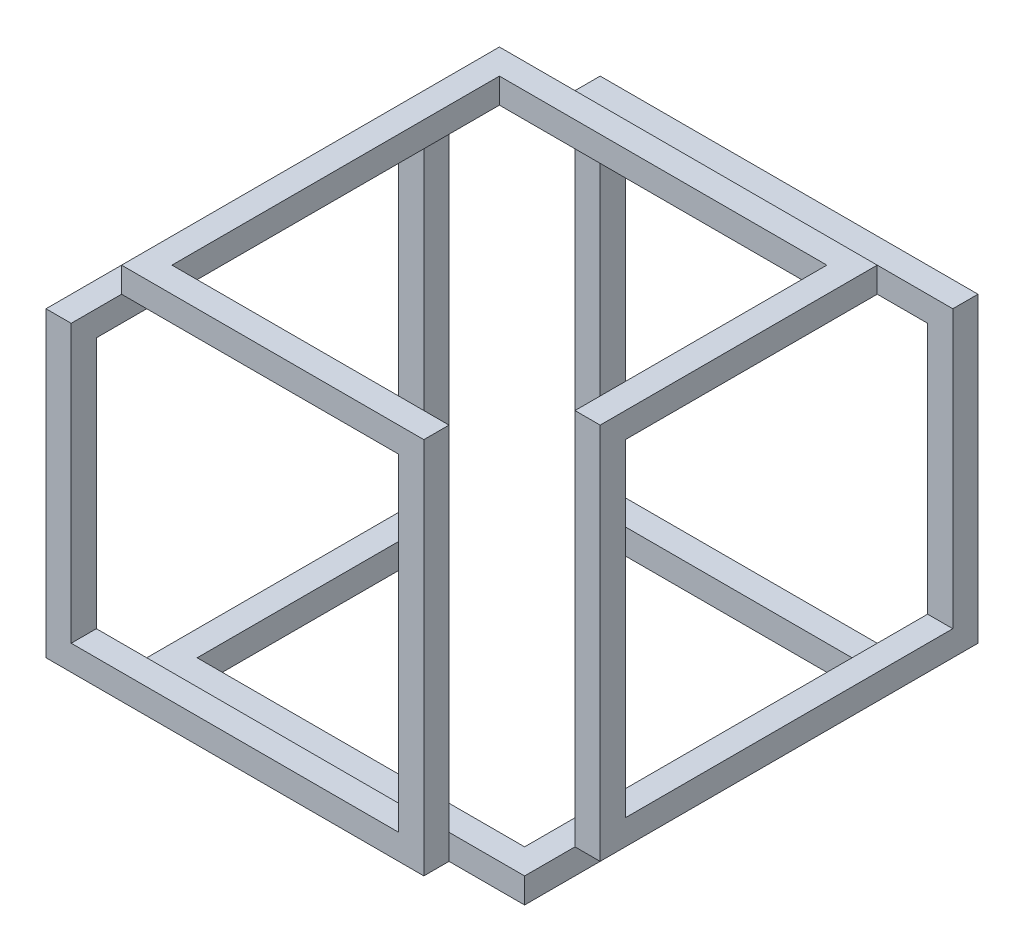
ISO-10303-21;
HEADER;
FILE_DESCRIPTION(('STEP AP214'),'2;1');
FILE_NAME('part.step','',(''),(''),'','','');
FILE_SCHEMA(('AUTOMOTIVE_DESIGN { 1 0 10303 214 1 1 1 1 }'));
ENDSEC;
DATA;
#1=APPLICATION_CONTEXT('core data for automotive mechanical design processes');
#2=APPLICATION_PROTOCOL_DEFINITION('international standard','automotive_design',2000,#1);
#3=PRODUCT_CONTEXT('',#1,'mechanical');
#4=PRODUCT('Part','Part','',(#3));
#5=PRODUCT_RELATED_PRODUCT_CATEGORY('part','',(#4));
#6=PRODUCT_DEFINITION_FORMATION('','',#4);
#7=PRODUCT_DEFINITION_CONTEXT('part definition',#1,'design');
#8=PRODUCT_DEFINITION('design','',#6,#7);
#9=PRODUCT_DEFINITION_SHAPE('','',#8);
#10=(LENGTH_UNIT() NAMED_UNIT(*) SI_UNIT(.MILLI.,.METRE.));
#11=(NAMED_UNIT(*) PLANE_ANGLE_UNIT() SI_UNIT($,.RADIAN.));
#12=(NAMED_UNIT(*) SI_UNIT($,.STERADIAN.) SOLID_ANGLE_UNIT());
#13=UNCERTAINTY_MEASURE_WITH_UNIT(LENGTH_MEASURE(1.E-05),#10,'distance_accuracy_value','');
#14=(GEOMETRIC_REPRESENTATION_CONTEXT(3) GLOBAL_UNCERTAINTY_ASSIGNED_CONTEXT((#13)) GLOBAL_UNIT_ASSIGNED_CONTEXT((#10,
#11,#12)) REPRESENTATION_CONTEXT('',''));
#15=CARTESIAN_POINT('',(0.,0.,0.));
#16=DIRECTION('',(0.,0.,1.));
#17=DIRECTION('',(1.,0.,0.));
#18=AXIS2_PLACEMENT_3D('',#15,#16,#17);
#19=CARTESIAN_POINT('',(74.9999999999999,95.,40.));
#20=DIRECTION('',(0.,1.,0.));
#21=DIRECTION('',(0.,0.,1.));
#22=AXIS2_PLACEMENT_3D('',#19,#20,#21);
#23=PLANE('',#22);
#24=DIRECTION('',(0.,0.,-1.));
#25=VECTOR('',#24,1.);
#26=CARTESIAN_POINT('',(35.,95.,180.));
#27=LINE('',#26,#25);
#28=CARTESIAN_POINT('',(35.,95.,190.));
#29=VERTEX_POINT('',#28);
#30=CARTESIAN_POINT('',(35.,95.,180.));
#31=VERTEX_POINT('',#30);
#32=EDGE_CURVE('E281',#29,#31,#27,.T.);
#33=ORIENTED_EDGE('',*,*,#32,.F.);
#34=DIRECTION('',(1.,0.,0.));
#35=VECTOR('',#34,1.);
#36=CARTESIAN_POINT('',(-75.,95.,190.));
#37=LINE('',#36,#35);
#38=CARTESIAN_POINT('',(-75.,95.,190.));
#39=VERTEX_POINT('',#38);
#40=EDGE_CURVE('E292',#39,#29,#37,.T.);
#41=ORIENTED_EDGE('',*,*,#40,.F.);
#42=DIRECTION('',(0.,0.,1.));
#43=VECTOR('',#42,1.);
#44=CARTESIAN_POINT('',(-75.,95.,40.));
#45=LINE('',#44,#43);
#46=CARTESIAN_POINT('',(-75.,95.,40.));
#47=VERTEX_POINT('',#46);
#48=EDGE_CURVE('E326',#47,#39,#45,.T.);
#49=ORIENTED_EDGE('',*,*,#48,.F.);
#50=DIRECTION('',(-1.,0.,0.));
#51=VECTOR('',#50,1.);
#52=CARTESIAN_POINT('',(74.9999999999999,95.,40.));
#53=LINE('',#52,#51);
#54=CARTESIAN_POINT('',(74.9999999999999,95.,40.));
#55=VERTEX_POINT('',#54);
#56=EDGE_CURVE('E347',#55,#47,#53,.T.);
#57=ORIENTED_EDGE('',*,*,#56,.F.);
#58=DIRECTION('',(0.,0.,1.));
#59=VECTOR('',#58,1.);
#60=CARTESIAN_POINT('',(74.9999999999999,95.,40.));
#61=LINE('',#60,#59);
#62=CARTESIAN_POINT('',(74.9999999999999,95.,140.));
#63=VERTEX_POINT('',#62);
#64=EDGE_CURVE('E360',#55,#63,#61,.T.);
#65=ORIENTED_EDGE('',*,*,#64,.T.);
#66=DIRECTION('',(-1.,0.,0.));
#67=VECTOR('',#66,1.);
#68=CARTESIAN_POINT('',(74.9999999999999,95.,140.));
#69=LINE('',#68,#67);
#70=CARTESIAN_POINT('',(64.9999999999999,95.,140.));
#71=VERTEX_POINT('',#70);
#72=EDGE_CURVE('E342',#63,#71,#69,.T.);
#73=ORIENTED_EDGE('',*,*,#72,.T.);
#74=DIRECTION('',(0.,0.,1.));
#75=VECTOR('',#74,1.);
#76=CARTESIAN_POINT('',(64.9999999999999,95.,40.));
#77=LINE('',#76,#75);
#78=CARTESIAN_POINT('',(65.,95.,50.));
#79=VERTEX_POINT('',#78);
#80=EDGE_CURVE('E354',#79,#71,#77,.T.);
#81=ORIENTED_EDGE('',*,*,#80,.F.);
#82=DIRECTION('',(1.,0.,0.));
#83=VECTOR('',#82,1.);
#84=CARTESIAN_POINT('',(-75.,95.,50.));
#85=LINE('',#84,#83);
#86=CARTESIAN_POINT('',(-65.,95.,50.));
#87=VERTEX_POINT('',#86);
#88=EDGE_CURVE('E339',#87,#79,#85,.T.);
#89=ORIENTED_EDGE('',*,*,#88,.F.);
#90=DIRECTION('',(0.,0.,-1.));
#91=VECTOR('',#90,1.);
#92=CARTESIAN_POINT('',(-65.,95.,190.));
#93=LINE('',#92,#91);
#94=CARTESIAN_POINT('',(-65.,95.,180.));
#95=VERTEX_POINT('',#94);
#96=EDGE_CURVE('E318',#95,#87,#93,.T.);
#97=ORIENTED_EDGE('',*,*,#96,.F.);
#98=DIRECTION('',(-1.,0.,0.));
#99=VECTOR('',#98,1.);
#100=CARTESIAN_POINT('',(45.,95.,180.));
#101=LINE('',#100,#99);
#102=EDGE_CURVE('E295',#31,#95,#101,.T.);
#103=ORIENTED_EDGE('',*,*,#102,.F.);
#104=EDGE_LOOP('',(#33,#41,#49,#57,#65,#73,#81,#89,#97,#103));
#105=FACE_BOUND('',#104,.T.);
#106=ADVANCED_FACE('F41',(#105),#23,.F.);
#107=CARTESIAN_POINT('',(45.,-34.9999999999998,190.));
#108=DIRECTION('',(0.,-1.,0.));
#109=DIRECTION('',(1.,0.,0.));
#110=AXIS2_PLACEMENT_3D('',#107,#108,#109);
#111=PLANE('',#110);
#112=DIRECTION('',(0.,0.,1.));
#113=VECTOR('',#112,1.);
#114=CARTESIAN_POINT('',(35.,-34.9999999999998,190.));
#115=LINE('',#114,#113);
#116=CARTESIAN_POINT('',(35.,-34.9999999999998,180.));
#117=VERTEX_POINT('',#116);
#118=CARTESIAN_POINT('',(35.,-34.9999999999998,190.));
#119=VERTEX_POINT('',#118);
#120=EDGE_CURVE('E11',#117,#119,#115,.T.);
#121=ORIENTED_EDGE('',*,*,#120,.F.);
#122=DIRECTION('',(-1.,0.,0.));
#123=VECTOR('',#122,1.);
#124=CARTESIAN_POINT('',(45.,-34.9999999999998,180.));
#125=LINE('',#124,#123);
#126=CARTESIAN_POINT('',(-95.0000000000001,-35.,180.));
#127=VERTEX_POINT('',#126);
#128=EDGE_CURVE('E714',#117,#127,#125,.T.);
#129=ORIENTED_EDGE('',*,*,#128,.T.);
#130=DIRECTION('',(0.,0.,1.));
#131=VECTOR('',#130,1.);
#132=CARTESIAN_POINT('',(-95.0000000000001,-35.,190.));
#133=LINE('',#132,#131);
#134=CARTESIAN_POINT('',(-95.0000000000001,-35.,190.));
#135=VERTEX_POINT('',#134);
#136=EDGE_CURVE('E286',#127,#135,#133,.T.);
#137=ORIENTED_EDGE('',*,*,#136,.T.);
#138=DIRECTION('',(-1.,0.,0.));
#139=VECTOR('',#138,1.);
#140=CARTESIAN_POINT('',(45.,-34.9999999999998,190.));
#141=LINE('',#140,#139);
#142=EDGE_CURVE('E57',#119,#135,#141,.T.);
#143=ORIENTED_EDGE('',*,*,#142,.F.);
#144=EDGE_LOOP('',(#121,#129,#137,#143));
#145=FACE_BOUND('',#144,.T.);
#146=ADVANCED_FACE('F786',(#145),#111,.F.);
#147=CARTESIAN_POINT('',(-95.,-65.0000000000001,40.));
#148=DIRECTION('',(-1.,0.,0.));
#149=DIRECTION('',(0.,-1.,0.));
#150=AXIS2_PLACEMENT_3D('',#147,#148,#149);
#151=PLANE('',#150);
#152=ORIENTED_EDGE('',*,*,#136,.F.);
#153=DIRECTION('',(0.,1.,0.));
#154=VECTOR('',#153,1.);
#155=CARTESIAN_POINT('',(-95.,-45.,180.));
#156=LINE('',#155,#154);
#157=CARTESIAN_POINT('',(-95.,65.,180.));
#158=VERTEX_POINT('',#157);
#159=EDGE_CURVE('E740',#127,#158,#156,.T.);
#160=ORIENTED_EDGE('',*,*,#159,.T.);
#161=DIRECTION('',(0.,0.,-1.));
#162=VECTOR('',#161,1.);
#163=CARTESIAN_POINT('',(-95.,65.,190.));
#164=LINE('',#163,#162);
#165=CARTESIAN_POINT('',(-95.,65.,50.));
#166=VERTEX_POINT('',#165);
#167=EDGE_CURVE('E703',#158,#166,#164,.T.);
#168=ORIENTED_EDGE('',*,*,#167,.T.);
#169=DIRECTION('',(0.,-1.,0.));
#170=VECTOR('',#169,1.);
#171=CARTESIAN_POINT('',(-95.,75.,50.));
#172=LINE('',#171,#170);
#173=CARTESIAN_POINT('',(-95.,-65.,50.));
#174=VERTEX_POINT('',#173);
#175=EDGE_CURVE('E414',#166,#174,#172,.T.);
#176=ORIENTED_EDGE('',*,*,#175,.T.);
#177=DIRECTION('',(0.,0.,1.));
#178=VECTOR('',#177,1.);
#179=CARTESIAN_POINT('',(-95.,-65.0000000000001,40.));
#180=LINE('',#179,#178);
#181=CARTESIAN_POINT('',(-95.,-65.0000000000001,140.));
#182=VERTEX_POINT('',#181);
#183=EDGE_CURVE('E440',#174,#182,#180,.T.);
#184=ORIENTED_EDGE('',*,*,#183,.T.);
#185=DIRECTION('',(0.,-1.,0.));
#186=VECTOR('',#185,1.);
#187=CARTESIAN_POINT('',(-95.,-65.0000000000001,140.));
#188=LINE('',#187,#186);
#189=CARTESIAN_POINT('',(-95.,-75.0000000000001,140.));
#190=VERTEX_POINT('',#189);
#191=EDGE_CURVE('E423',#182,#190,#188,.T.);
#192=ORIENTED_EDGE('',*,*,#191,.T.);
#193=DIRECTION('',(0.,0.,1.));
#194=VECTOR('',#193,1.);
#195=CARTESIAN_POINT('',(-95.,-75.0000000000001,40.));
#196=LINE('',#195,#194);
#197=CARTESIAN_POINT('',(-95.,-75.0000000000001,40.));
#198=VERTEX_POINT('',#197);
#199=EDGE_CURVE('E434',#198,#190,#196,.T.);
#200=ORIENTED_EDGE('',*,*,#199,.F.);
#201=DIRECTION('',(0.,-1.,0.));
#202=VECTOR('',#201,1.);
#203=CARTESIAN_POINT('',(-95.,-65.0000000000001,40.));
#204=LINE('',#203,#202);
#205=CARTESIAN_POINT('',(-95.,75.,40.));
#206=VERTEX_POINT('',#205);
#207=EDGE_CURVE('E427',#206,#198,#204,.T.);
#208=ORIENTED_EDGE('',*,*,#207,.F.);
#209=DIRECTION('',(0.,0.,-1.));
#210=VECTOR('',#209,1.);
#211=CARTESIAN_POINT('',(-95.,75.,40.));
#212=LINE('',#211,#210);
#213=CARTESIAN_POINT('',(-95.,75.,190.));
#214=VERTEX_POINT('',#213);
#215=EDGE_CURVE('E406',#214,#206,#212,.T.);
#216=ORIENTED_EDGE('',*,*,#215,.F.);
#217=DIRECTION('',(0.,1.,0.));
#218=VECTOR('',#217,1.);
#219=CARTESIAN_POINT('',(-95.,75.,190.));
#220=LINE('',#219,#218);
#221=EDGE_CURVE('E626',#135,#214,#220,.T.);
#222=ORIENTED_EDGE('',*,*,#221,.F.);
#223=EDGE_LOOP('',(#152,#160,#168,#176,#184,#192,#200,#208,#216,#222));
#224=FACE_BOUND('',#223,.T.);
#225=ADVANCED_FACE('F625',(#224),#151,.F.);
#226=CARTESIAN_POINT('',(-105.,65.,190.));
#227=DIRECTION('',(0.,1.,0.));
#228=DIRECTION('',(0.,0.,1.));
#229=AXIS2_PLACEMENT_3D('',#226,#227,#228);
#230=PLANE('',#229);
#231=DIRECTION('',(1.,0.,0.));
#232=VECTOR('',#231,1.);
#233=CARTESIAN_POINT('',(-105.,65.,180.));
#234=LINE('',#233,#232);
#235=CARTESIAN_POINT('',(-105.,65.,180.));
#236=VERTEX_POINT('',#235);
#237=EDGE_CURVE('E728',#236,#158,#234,.T.);
#238=ORIENTED_EDGE('',*,*,#237,.F.);
#239=DIRECTION('',(0.,0.,-1.));
#240=VECTOR('',#239,1.);
#241=CARTESIAN_POINT('',(-105.,65.,190.));
#242=LINE('',#241,#240);
#243=CARTESIAN_POINT('',(-105.,65.,50.));
#244=VERTEX_POINT('',#243);
#245=EDGE_CURVE('E697',#236,#244,#242,.T.);
#246=ORIENTED_EDGE('',*,*,#245,.T.);
#247=DIRECTION('',(1.,0.,0.));
#248=VECTOR('',#247,1.);
#249=CARTESIAN_POINT('',(-105.,65.,50.));
#250=LINE('',#249,#248);
#251=EDGE_CURVE('E749',#244,#166,#250,.T.);
#252=ORIENTED_EDGE('',*,*,#251,.T.);
#253=ORIENTED_EDGE('',*,*,#167,.F.);
#254=EDGE_LOOP('',(#238,#246,#252,#253));
#255=FACE_BOUND('',#254,.T.);
#256=ADVANCED_FACE('F779',(#255),#230,.F.);
#257=CARTESIAN_POINT('',(-105.,75.,50.));
#258=DIRECTION('',(0.,0.,-1.));
#259=DIRECTION('',(-1.,0.,0.));
#260=AXIS2_PLACEMENT_3D('',#257,#258,#259);
#261=PLANE('',#260);
#262=ORIENTED_EDGE('',*,*,#251,.F.);
#263=DIRECTION('',(0.,-1.,0.));
#264=VECTOR('',#263,1.);
#265=CARTESIAN_POINT('',(-105.,75.,50.));
#266=LINE('',#265,#264);
#267=CARTESIAN_POINT('',(-105.,-65.,50.));
#268=VERTEX_POINT('',#267);
#269=EDGE_CURVE('E420',#244,#268,#266,.T.);
#270=ORIENTED_EDGE('',*,*,#269,.T.);
#271=DIRECTION('',(1.,0.,0.));
#272=VECTOR('',#271,1.);
#273=CARTESIAN_POINT('',(-105.,-65.,50.));
#274=LINE('',#273,#272);
#275=EDGE_CURVE('E402',#268,#174,#274,.T.);
#276=ORIENTED_EDGE('',*,*,#275,.T.);
#277=ORIENTED_EDGE('',*,*,#175,.F.);
#278=EDGE_LOOP('',(#262,#270,#276,#277));
#279=FACE_BOUND('',#278,.T.);
#280=ADVANCED_FACE('F783',(#279),#261,.F.);
#281=CARTESIAN_POINT('',(-65.,105.,190.));
#282=DIRECTION('',(-1.,0.,0.));
#283=DIRECTION('',(0.,0.,1.));
#284=AXIS2_PLACEMENT_3D('',#281,#282,#283);
#285=PLANE('',#284);
#286=DIRECTION('',(0.,1.,0.));
#287=VECTOR('',#286,1.);
#288=CARTESIAN_POINT('',(-65.,105.,180.));
#289=LINE('',#288,#287);
#290=CARTESIAN_POINT('',(-65.,105.,180.));
#291=VERTEX_POINT('',#290);
#292=EDGE_CURVE('E691',#95,#291,#289,.T.);
#293=ORIENTED_EDGE('',*,*,#292,.F.);
#294=ORIENTED_EDGE('',*,*,#96,.T.);
#295=DIRECTION('',(0.,1.,0.));
#296=VECTOR('',#295,1.);
#297=CARTESIAN_POINT('',(-65.,105.,50.));
#298=LINE('',#297,#296);
#299=CARTESIAN_POINT('',(-65.,105.,50.));
#300=VERTEX_POINT('',#299);
#301=EDGE_CURVE('E309',#87,#300,#298,.T.);
#302=ORIENTED_EDGE('',*,*,#301,.T.);
#303=DIRECTION('',(0.,0.,-1.));
#304=VECTOR('',#303,1.);
#305=CARTESIAN_POINT('',(-65.,105.,190.));
#306=LINE('',#305,#304);
#307=EDGE_CURVE('E307',#291,#300,#306,.T.);
#308=ORIENTED_EDGE('',*,*,#307,.F.);
#309=EDGE_LOOP('',(#293,#294,#302,#308));
#310=FACE_BOUND('',#309,.T.);
#311=ADVANCED_FACE('F690',(#310),#285,.F.);
#312=CARTESIAN_POINT('',(-75.,105.,50.));
#313=DIRECTION('',(0.,0.,-1.));
#314=DIRECTION('',(-1.,0.,0.));
#315=AXIS2_PLACEMENT_3D('',#312,#313,#314);
#316=PLANE('',#315);
#317=ORIENTED_EDGE('',*,*,#301,.F.);
#318=ORIENTED_EDGE('',*,*,#88,.T.);
#319=DIRECTION('',(0.,1.,0.));
#320=VECTOR('',#319,1.);
#321=CARTESIAN_POINT('',(65.,105.,50.));
#322=LINE('',#321,#320);
#323=CARTESIAN_POINT('',(65.,105.,50.));
#324=VERTEX_POINT('',#323);
#325=EDGE_CURVE('E321',#79,#324,#322,.T.);
#326=ORIENTED_EDGE('',*,*,#325,.T.);
#327=DIRECTION('',(1.,0.,0.));
#328=VECTOR('',#327,1.);
#329=CARTESIAN_POINT('',(-75.,105.,50.));
#330=LINE('',#329,#328);
#331=EDGE_CURVE('E333',#300,#324,#330,.T.);
#332=ORIENTED_EDGE('',*,*,#331,.F.);
#333=EDGE_LOOP('',(#317,#318,#326,#332));
#334=FACE_BOUND('',#333,.T.);
#335=ADVANCED_FACE('F685',(#334),#316,.F.);
#336=CARTESIAN_POINT('',(65.,-45.,10.));
#337=DIRECTION('',(1.,0.,0.));
#338=DIRECTION('',(0.,0.,-1.));
#339=AXIS2_PLACEMENT_3D('',#336,#337,#338);
#340=PLANE('',#339);
#341=ORIENTED_EDGE('',*,*,#325,.F.);
#342=ORIENTED_EDGE('',*,*,#80,.T.);
#343=DIRECTION('',(0.,-1.,0.));
#344=VECTOR('',#343,1.);
#345=CARTESIAN_POINT('',(64.9999999999999,105.,140.));
#346=LINE('',#345,#344);
#347=CARTESIAN_POINT('',(65.,-35.,140.));
#348=VERTEX_POINT('',#347);
#349=EDGE_CURVE('E374',#71,#348,#346,.T.);
#350=ORIENTED_EDGE('',*,*,#349,.T.);
#351=DIRECTION('',(0.,0.,-1.));
#352=VECTOR('',#351,1.);
#353=CARTESIAN_POINT('',(65.,-35.,150.));
#354=LINE('',#353,#352);
#355=CARTESIAN_POINT('',(65.,-35.,10.));
#356=VERTEX_POINT('',#355);
#357=EDGE_CURVE('E395',#348,#356,#354,.T.);
#358=ORIENTED_EDGE('',*,*,#357,.T.);
#359=DIRECTION('',(0.,-1.,0.));
#360=VECTOR('',#359,1.);
#361=CARTESIAN_POINT('',(65.,-45.,10.));
#362=LINE('',#361,#360);
#363=CARTESIAN_POINT('',(65.,65.,10.));
#364=VERTEX_POINT('',#363);
#365=EDGE_CURVE('E505',#364,#356,#362,.T.);
#366=ORIENTED_EDGE('',*,*,#365,.F.);
#367=DIRECTION('',(0.,0.,-1.));
#368=VECTOR('',#367,1.);
#369=CARTESIAN_POINT('',(65.,65.,10.));
#370=LINE('',#369,#368);
#371=CARTESIAN_POINT('',(65.,65.,0.));
#372=VERTEX_POINT('',#371);
#373=EDGE_CURVE('E560',#364,#372,#370,.T.);
#374=ORIENTED_EDGE('',*,*,#373,.T.);
#375=DIRECTION('',(0.,-1.,0.));
#376=VECTOR('',#375,1.);
#377=CARTESIAN_POINT('',(65.,-45.,0.));
#378=LINE('',#377,#376);
#379=CARTESIAN_POINT('',(65.,-45.,0.));
#380=VERTEX_POINT('',#379);
#381=EDGE_CURVE('E534',#372,#380,#378,.T.);
#382=ORIENTED_EDGE('',*,*,#381,.T.);
#383=DIRECTION('',(0.,0.,-1.));
#384=VECTOR('',#383,1.);
#385=CARTESIAN_POINT('',(65.,-45.,10.));
#386=LINE('',#385,#384);
#387=CARTESIAN_POINT('',(65.,-45.,150.));
#388=VERTEX_POINT('',#387);
#389=EDGE_CURVE('E556',#388,#380,#386,.T.);
#390=ORIENTED_EDGE('',*,*,#389,.F.);
#391=DIRECTION('',(0.,-1.,0.));
#392=VECTOR('',#391,1.);
#393=CARTESIAN_POINT('',(65.,-45.,150.));
#394=LINE('',#393,#392);
#395=CARTESIAN_POINT('',(64.9999999999999,105.,150.));
#396=VERTEX_POINT('',#395);
#397=EDGE_CURVE('E387',#396,#388,#394,.T.);
#398=ORIENTED_EDGE('',*,*,#397,.F.);
#399=DIRECTION('',(0.,0.,1.));
#400=VECTOR('',#399,1.);
#401=CARTESIAN_POINT('',(64.9999999999999,105.,150.));
#402=LINE('',#401,#400);
#403=EDGE_CURVE('E367',#324,#396,#402,.T.);
#404=ORIENTED_EDGE('',*,*,#403,.F.);
#405=EDGE_LOOP('',(#341,#342,#350,#358,#366,#374,#382,#390,#398,#404));
#406=FACE_BOUND('',#405,.T.);
#407=ADVANCED_FACE('F659',(#406),#340,.F.);
#408=CARTESIAN_POINT('',(74.9999999999999,105.,140.));
#409=DIRECTION('',(0.,0.,1.));
#410=DIRECTION('',(1.,0.,0.));
#411=AXIS2_PLACEMENT_3D('',#408,#409,#410);
#412=PLANE('',#411);
#413=ORIENTED_EDGE('',*,*,#72,.F.);
#414=DIRECTION('',(0.,-1.,0.));
#415=VECTOR('',#414,1.);
#416=CARTESIAN_POINT('',(74.9999999999999,105.,140.));
#417=LINE('',#416,#415);
#418=CARTESIAN_POINT('',(75.,-35.,140.));
#419=VERTEX_POINT('',#418);
#420=EDGE_CURVE('E380',#63,#419,#417,.T.);
#421=ORIENTED_EDGE('',*,*,#420,.T.);
#422=DIRECTION('',(-1.,0.,0.));
#423=VECTOR('',#422,1.);
#424=CARTESIAN_POINT('',(75.,-35.,140.));
#425=LINE('',#424,#423);
#426=EDGE_CURVE('E363',#419,#348,#425,.T.);
#427=ORIENTED_EDGE('',*,*,#426,.T.);
#428=ORIENTED_EDGE('',*,*,#349,.F.);
#429=EDGE_LOOP('',(#413,#421,#427,#428));
#430=FACE_BOUND('',#429,.T.);
#431=ADVANCED_FACE('F679',(#430),#412,.F.);
#432=CARTESIAN_POINT('',(75.,-35.,150.));
#433=DIRECTION('',(0.,-1.,0.));
#434=DIRECTION('',(1.,0.,0.));
#435=AXIS2_PLACEMENT_3D('',#432,#433,#434);
#436=PLANE('',#435);
#437=ORIENTED_EDGE('',*,*,#426,.F.);
#438=DIRECTION('',(0.,0.,-1.));
#439=VECTOR('',#438,1.);
#440=CARTESIAN_POINT('',(75.,-35.,150.));
#441=LINE('',#440,#439);
#442=CARTESIAN_POINT('',(75.,-35.,10.));
#443=VERTEX_POINT('',#442);
#444=EDGE_CURVE('E64',#419,#443,#441,.T.);
#445=ORIENTED_EDGE('',*,*,#444,.T.);
#446=DIRECTION('',(-1.,0.,0.));
#447=VECTOR('',#446,1.);
#448=CARTESIAN_POINT('',(75.,-35.,10.));
#449=LINE('',#448,#447);
#450=EDGE_CURVE('E383',#443,#356,#449,.T.);
#451=ORIENTED_EDGE('',*,*,#450,.T.);
#452=ORIENTED_EDGE('',*,*,#357,.F.);
#453=EDGE_LOOP('',(#437,#445,#451,#452));
#454=FACE_BOUND('',#453,.T.);
#455=ADVANCED_FACE('F819',(#454),#436,.F.);
#456=CARTESIAN_POINT('',(0.,0.,10.));
#457=DIRECTION('',(0.,0.,1.));
#458=DIRECTION('',(1.,0.,0.));
#459=AXIS2_PLACEMENT_3D('',#456,#457,#458);
#460=PLANE('',#459);
#461=ORIENTED_EDGE('',*,*,#365,.T.);
#462=ORIENTED_EDGE('',*,*,#450,.F.);
#463=DIRECTION('',(0.,1.,0.));
#464=VECTOR('',#463,1.);
#465=CARTESIAN_POINT('',(75.,-45.,10.));
#466=LINE('',#465,#464);
#467=CARTESIAN_POINT('',(75.,75.,10.));
#468=VERTEX_POINT('',#467);
#469=EDGE_CURVE('E509',#443,#468,#466,.T.);
#470=ORIENTED_EDGE('',*,*,#469,.T.);
#471=DIRECTION('',(-1.,0.,0.));
#472=VECTOR('',#471,1.);
#473=CARTESIAN_POINT('',(75.,75.,10.));
#474=LINE('',#473,#472);
#475=CARTESIAN_POINT('',(-75.,75.,10.));
#476=VERTEX_POINT('',#475);
#477=EDGE_CURVE('E512',#468,#476,#474,.T.);
#478=ORIENTED_EDGE('',*,*,#477,.T.);
#479=DIRECTION('',(0.,-1.,0.));
#480=VECTOR('',#479,1.);
#481=CARTESIAN_POINT('',(-75.,-75.,10.));
#482=LINE('',#481,#480);
#483=CARTESIAN_POINT('',(-75.,-75.,10.));
#484=VERTEX_POINT('',#483);
#485=EDGE_CURVE('E487',#476,#484,#482,.T.);
#486=ORIENTED_EDGE('',*,*,#485,.T.);
#487=DIRECTION('',(1.,0.,0.));
#488=VECTOR('',#487,1.);
#489=CARTESIAN_POINT('',(45.,-75.,10.));
#490=LINE('',#489,#488);
#491=CARTESIAN_POINT('',(35.,-75.,10.));
#492=VERTEX_POINT('',#491);
#493=EDGE_CURVE('E491',#484,#492,#490,.T.);
#494=ORIENTED_EDGE('',*,*,#493,.T.);
#495=DIRECTION('',(0.,-1.,0.));
#496=VECTOR('',#495,1.);
#497=CARTESIAN_POINT('',(35.,-75.,10.));
#498=LINE('',#497,#496);
#499=CARTESIAN_POINT('',(35.,-65.,10.));
#500=VERTEX_POINT('',#499);
#501=EDGE_CURVE('E465',#500,#492,#498,.T.);
#502=ORIENTED_EDGE('',*,*,#501,.F.);
#503=DIRECTION('',(-1.,0.,0.));
#504=VECTOR('',#503,1.);
#505=CARTESIAN_POINT('',(45.,-65.,10.));
#506=LINE('',#505,#504);
#507=CARTESIAN_POINT('',(-65.,-65.,10.));
#508=VERTEX_POINT('',#507);
#509=EDGE_CURVE('E496',#500,#508,#506,.T.);
#510=ORIENTED_EDGE('',*,*,#509,.T.);
#511=DIRECTION('',(0.,1.,0.));
#512=VECTOR('',#511,1.);
#513=CARTESIAN_POINT('',(-65.,-65.,10.));
#514=LINE('',#513,#512);
#515=CARTESIAN_POINT('',(-65.,65.,10.));
#516=VERTEX_POINT('',#515);
#517=EDGE_CURVE('E499',#508,#516,#514,.T.);
#518=ORIENTED_EDGE('',*,*,#517,.T.);
#519=DIRECTION('',(1.,0.,0.));
#520=VECTOR('',#519,1.);
#521=CARTESIAN_POINT('',(65.,65.,10.));
#522=LINE('',#521,#520);
#523=EDGE_CURVE('E502',#516,#364,#522,.T.);
#524=ORIENTED_EDGE('',*,*,#523,.T.);
#525=EDGE_LOOP('',(#461,#462,#470,#478,#486,#494,#502,#510,#518,#524));
#526=FACE_BOUND('',#525,.T.);
#527=ADVANCED_FACE('F640',(#526),#460,.T.);
#528=CARTESIAN_POINT('',(45.,-65.,10.));
#529=DIRECTION('',(0.,-1.,0.));
#530=DIRECTION('',(1.,0.,0.));
#531=AXIS2_PLACEMENT_3D('',#528,#529,#530);
#532=PLANE('',#531);
#533=ORIENTED_EDGE('',*,*,#275,.F.);
#534=DIRECTION('',(0.,0.,-1.));
#535=VECTOR('',#534,1.);
#536=CARTESIAN_POINT('',(-105.,-65.0000000000001,150.));
#537=LINE('',#536,#535);
#538=CARTESIAN_POINT('',(-105.,-65.0000000000001,150.));
#539=VERTEX_POINT('',#538);
#540=EDGE_CURVE('E448',#539,#268,#537,.T.);
#541=ORIENTED_EDGE('',*,*,#540,.F.);
#542=DIRECTION('',(-1.,0.,0.));
#543=VECTOR('',#542,1.);
#544=CARTESIAN_POINT('',(45.,-65.,150.));
#545=LINE('',#544,#543);
#546=CARTESIAN_POINT('',(45.,-65.,150.));
#547=VERTEX_POINT('',#546);
#548=EDGE_CURVE('E470',#547,#539,#545,.T.);
#549=ORIENTED_EDGE('',*,*,#548,.F.);
#550=DIRECTION('',(0.,0.,-1.));
#551=VECTOR('',#550,1.);
#552=CARTESIAN_POINT('',(45.,-65.,10.));
#553=LINE('',#552,#551);
#554=CARTESIAN_POINT('',(45.,-65.,0.));
#555=VERTEX_POINT('',#554);
#556=EDGE_CURVE('E572',#547,#555,#553,.T.);
#557=ORIENTED_EDGE('',*,*,#556,.T.);
#558=DIRECTION('',(-1.,0.,0.));
#559=VECTOR('',#558,1.);
#560=CARTESIAN_POINT('',(45.,-65.,0.));
#561=LINE('',#560,#559);
#562=CARTESIAN_POINT('',(-65.,-65.,0.));
#563=VERTEX_POINT('',#562);
#564=EDGE_CURVE('E525',#555,#563,#561,.T.);
#565=ORIENTED_EDGE('',*,*,#564,.T.);
#566=DIRECTION('',(0.,0.,-1.));
#567=VECTOR('',#566,1.);
#568=CARTESIAN_POINT('',(-65.,-65.,10.));
#569=LINE('',#568,#567);
#570=EDGE_CURVE('E568',#508,#563,#569,.T.);
#571=ORIENTED_EDGE('',*,*,#570,.F.);
#572=ORIENTED_EDGE('',*,*,#509,.F.);
#573=DIRECTION('',(0.,0.,-1.));
#574=VECTOR('',#573,1.);
#575=CARTESIAN_POINT('',(35.,-65.,150.));
#576=LINE('',#575,#574);
#577=CARTESIAN_POINT('',(35.,-65.,140.));
#578=VERTEX_POINT('',#577);
#579=EDGE_CURVE('E483',#578,#500,#576,.T.);
#580=ORIENTED_EDGE('',*,*,#579,.F.);
#581=DIRECTION('',(1.,0.,0.));
#582=VECTOR('',#581,1.);
#583=CARTESIAN_POINT('',(-105.,-65.0000000000001,140.));
#584=LINE('',#583,#582);
#585=EDGE_CURVE('E462',#182,#578,#584,.T.);
#586=ORIENTED_EDGE('',*,*,#585,.F.);
#587=ORIENTED_EDGE('',*,*,#183,.F.);
#588=EDGE_LOOP('',(#533,#541,#549,#557,#565,#571,#572,#580,#586,#587));
#589=FACE_BOUND('',#588,.T.);
#590=ADVANCED_FACE('F601',(#589),#532,.F.);
#591=CARTESIAN_POINT('',(-105.,-75.0000000000001,140.));
#592=DIRECTION('',(0.,0.,1.));
#593=DIRECTION('',(1.,0.,0.));
#594=AXIS2_PLACEMENT_3D('',#591,#592,#593);
#595=PLANE('',#594);
#596=ORIENTED_EDGE('',*,*,#191,.F.);
#597=ORIENTED_EDGE('',*,*,#585,.T.);
#598=DIRECTION('',(0.,-1.,0.));
#599=VECTOR('',#598,1.);
#600=CARTESIAN_POINT('',(35.,-75.,140.));
#601=LINE('',#600,#599);
#602=CARTESIAN_POINT('',(35.,-75.,140.));
#603=VERTEX_POINT('',#602);
#604=EDGE_CURVE('E443',#578,#603,#601,.T.);
#605=ORIENTED_EDGE('',*,*,#604,.T.);
#606=DIRECTION('',(1.,0.,0.));
#607=VECTOR('',#606,1.);
#608=CARTESIAN_POINT('',(-105.,-75.0000000000001,140.));
#609=LINE('',#608,#607);
#610=EDGE_CURVE('E456',#190,#603,#609,.T.);
#611=ORIENTED_EDGE('',*,*,#610,.F.);
#612=EDGE_LOOP('',(#596,#597,#605,#611));
#613=FACE_BOUND('',#612,.T.);
#614=ADVANCED_FACE('F631',(#613),#595,.F.);
#615=CARTESIAN_POINT('',(35.,-75.,150.));
#616=DIRECTION('',(1.,0.,0.));
#617=DIRECTION('',(0.,1.,0.));
#618=AXIS2_PLACEMENT_3D('',#615,#616,#617);
#619=PLANE('',#618);
#620=ORIENTED_EDGE('',*,*,#604,.F.);
#621=ORIENTED_EDGE('',*,*,#579,.T.);
#622=ORIENTED_EDGE('',*,*,#501,.T.);
#623=DIRECTION('',(0.,0.,-1.));
#624=VECTOR('',#623,1.);
#625=CARTESIAN_POINT('',(35.,-75.,150.));
#626=LINE('',#625,#624);
#627=EDGE_CURVE('E477',#603,#492,#626,.T.);
#628=ORIENTED_EDGE('',*,*,#627,.F.);
#629=EDGE_LOOP('',(#620,#621,#622,#628));
#630=FACE_BOUND('',#629,.T.);
#631=ADVANCED_FACE('F637',(#630),#619,.F.);
#632=CARTESIAN_POINT('',(-75.,-75.,10.));
#633=DIRECTION('',(1.,0.,0.));
#634=DIRECTION('',(0.,0.,-1.));
#635=AXIS2_PLACEMENT_3D('',#632,#633,#634);
#636=PLANE('',#635);
#637=DIRECTION('',(0.,-1.,0.));
#638=VECTOR('',#637,1.);
#639=CARTESIAN_POINT('',(-75.,-75.,0.));
#640=LINE('',#639,#638);
#641=CARTESIAN_POINT('',(-75.,75.,0.));
#642=VERTEX_POINT('',#641);
#643=CARTESIAN_POINT('',(-75.,-75.,0.));
#644=VERTEX_POINT('',#643);
#645=EDGE_CURVE('E486',#642,#644,#640,.T.);
#646=ORIENTED_EDGE('',*,*,#645,.T.);
#647=DIRECTION('',(0.,0.,-1.));
#648=VECTOR('',#647,1.);
#649=CARTESIAN_POINT('',(-75.,-75.,10.));
#650=LINE('',#649,#648);
#651=EDGE_CURVE('E50',#484,#644,#650,.T.);
#652=ORIENTED_EDGE('',*,*,#651,.F.);
#653=ORIENTED_EDGE('',*,*,#485,.F.);
#654=DIRECTION('',(0.,0.,-1.));
#655=VECTOR('',#654,1.);
#656=CARTESIAN_POINT('',(-75.,75.,10.));
#657=LINE('',#656,#655);
#658=EDGE_CURVE('E515',#476,#642,#657,.T.);
#659=ORIENTED_EDGE('',*,*,#658,.T.);
#660=EDGE_LOOP('',(#646,#652,#653,#659));
#661=FACE_BOUND('',#660,.T.);
#662=ADVANCED_FACE('F43',(#661),#636,.F.);
#663=CARTESIAN_POINT('',(45.,-75.,10.));
#664=DIRECTION('',(0.,1.,0.));
#665=DIRECTION('',(-1.,0.,0.));
#666=AXIS2_PLACEMENT_3D('',#663,#664,#665);
#667=PLANE('',#666);
#668=DIRECTION('',(1.,0.,0.));
#669=VECTOR('',#668,1.);
#670=CARTESIAN_POINT('',(45.,-75.,0.));
#671=LINE('',#670,#669);
#672=CARTESIAN_POINT('',(45.,-75.,0.));
#673=VERTEX_POINT('',#672);
#674=EDGE_CURVE('E519',#644,#673,#671,.T.);
#675=ORIENTED_EDGE('',*,*,#674,.T.);
#676=DIRECTION('',(0.,0.,-1.));
#677=VECTOR('',#676,1.);
#678=CARTESIAN_POINT('',(45.,-75.,10.));
#679=LINE('',#678,#677);
#680=CARTESIAN_POINT('',(45.,-75.,150.));
#681=VERTEX_POINT('',#680);
#682=EDGE_CURVE('E576',#681,#673,#679,.T.);
#683=ORIENTED_EDGE('',*,*,#682,.F.);
#684=DIRECTION('',(1.,0.,0.));
#685=VECTOR('',#684,1.);
#686=CARTESIAN_POINT('',(45.,-75.,150.));
#687=LINE('',#686,#685);
#688=CARTESIAN_POINT('',(-105.,-75.0000000000001,150.));
#689=VERTEX_POINT('',#688);
#690=EDGE_CURVE('E473',#689,#681,#687,.T.);
#691=ORIENTED_EDGE('',*,*,#690,.F.);
#692=DIRECTION('',(0.,0.,1.));
#693=VECTOR('',#692,1.);
#694=CARTESIAN_POINT('',(-105.,-75.0000000000001,150.));
#695=LINE('',#694,#693);
#696=CARTESIAN_POINT('',(-105.,-75.0000000000001,40.));
#697=VERTEX_POINT('',#696);
#698=EDGE_CURVE('E452',#697,#689,#695,.T.);
#699=ORIENTED_EDGE('',*,*,#698,.F.);
#700=DIRECTION('',(-1.,0.,0.));
#701=VECTOR('',#700,1.);
#702=CARTESIAN_POINT('',(-105.,-75.0000000000001,40.));
#703=LINE('',#702,#701);
#704=EDGE_CURVE('E430',#198,#697,#703,.T.);
#705=ORIENTED_EDGE('',*,*,#704,.F.);
#706=ORIENTED_EDGE('',*,*,#199,.T.);
#707=ORIENTED_EDGE('',*,*,#610,.T.);
#708=ORIENTED_EDGE('',*,*,#627,.T.);
#709=ORIENTED_EDGE('',*,*,#493,.F.);
#710=ORIENTED_EDGE('',*,*,#651,.T.);
#711=EDGE_LOOP('',(#675,#683,#691,#699,#705,#706,#707,#708,#709,#710));
#712=FACE_BOUND('',#711,.T.);
#713=ADVANCED_FACE('F583',(#712),#667,.F.);
#714=CARTESIAN_POINT('',(45.,-75.,10.));
#715=DIRECTION('',(-1.,0.,0.));
#716=DIRECTION('',(0.,0.,1.));
#717=AXIS2_PLACEMENT_3D('',#714,#715,#716);
#718=PLANE('',#717);
#719=DIRECTION('',(0.,1.,0.));
#720=VECTOR('',#719,1.);
#721=CARTESIAN_POINT('',(45.,-75.,0.));
#722=LINE('',#721,#720);
#723=EDGE_CURVE('E522',#673,#555,#722,.T.);
#724=ORIENTED_EDGE('',*,*,#723,.T.);
#725=ORIENTED_EDGE('',*,*,#556,.F.);
#726=DIRECTION('',(0.,1.,0.));
#727=VECTOR('',#726,1.);
#728=CARTESIAN_POINT('',(45.,-75.,150.));
#729=LINE('',#728,#727);
#730=EDGE_CURVE('E466',#681,#547,#729,.T.);
#731=ORIENTED_EDGE('',*,*,#730,.F.);
#732=ORIENTED_EDGE('',*,*,#682,.T.);
#733=EDGE_LOOP('',(#724,#725,#731,#732));
#734=FACE_BOUND('',#733,.T.);
#735=ADVANCED_FACE('F596',(#734),#718,.F.);
#736=CARTESIAN_POINT('',(-65.,-65.,10.));
#737=DIRECTION('',(-1.,0.,0.));
#738=DIRECTION('',(0.,0.,1.));
#739=AXIS2_PLACEMENT_3D('',#736,#737,#738);
#740=PLANE('',#739);
#741=DIRECTION('',(0.,1.,0.));
#742=VECTOR('',#741,1.);
#743=CARTESIAN_POINT('',(-65.,-65.,0.));
#744=LINE('',#743,#742);
#745=CARTESIAN_POINT('',(-65.,65.,0.));
#746=VERTEX_POINT('',#745);
#747=EDGE_CURVE('E528',#563,#746,#744,.T.);
#748=ORIENTED_EDGE('',*,*,#747,.T.);
#749=DIRECTION('',(0.,0.,-1.));
#750=VECTOR('',#749,1.);
#751=CARTESIAN_POINT('',(-65.,65.,10.));
#752=LINE('',#751,#750);
#753=EDGE_CURVE('E564',#516,#746,#752,.T.);
#754=ORIENTED_EDGE('',*,*,#753,.F.);
#755=ORIENTED_EDGE('',*,*,#517,.F.);
#756=ORIENTED_EDGE('',*,*,#570,.T.);
#757=EDGE_LOOP('',(#748,#754,#755,#756));
#758=FACE_BOUND('',#757,.T.);
#759=ADVANCED_FACE('F853',(#758),#740,.F.);
#760=CARTESIAN_POINT('',(65.,65.,10.));
#761=DIRECTION('',(0.,1.,0.));
#762=DIRECTION('',(-1.,0.,0.));
#763=AXIS2_PLACEMENT_3D('',#760,#761,#762);
#764=PLANE('',#763);
#765=DIRECTION('',(1.,0.,0.));
#766=VECTOR('',#765,1.);
#767=CARTESIAN_POINT('',(65.,65.,0.));
#768=LINE('',#767,#766);
#769=EDGE_CURVE('E531',#746,#372,#768,.T.);
#770=ORIENTED_EDGE('',*,*,#769,.T.);
#771=ORIENTED_EDGE('',*,*,#373,.F.);
#772=ORIENTED_EDGE('',*,*,#523,.F.);
#773=ORIENTED_EDGE('',*,*,#753,.T.);
#774=EDGE_LOOP('',(#770,#771,#772,#773));
#775=FACE_BOUND('',#774,.T.);
#776=ADVANCED_FACE('F848',(#775),#764,.F.);
#777=CARTESIAN_POINT('',(75.,-45.,10.));
#778=DIRECTION('',(0.,1.,0.));
#779=DIRECTION('',(0.,0.,1.));
#780=AXIS2_PLACEMENT_3D('',#777,#778,#779);
#781=PLANE('',#780);
#782=DIRECTION('',(1.,0.,0.));
#783=VECTOR('',#782,1.);
#784=CARTESIAN_POINT('',(75.,-45.,0.));
#785=LINE('',#784,#783);
#786=CARTESIAN_POINT('',(75.,-45.,0.));
#787=VERTEX_POINT('',#786);
#788=EDGE_CURVE('E537',#380,#787,#785,.T.);
#789=ORIENTED_EDGE('',*,*,#788,.T.);
#790=DIRECTION('',(0.,0.,-1.));
#791=VECTOR('',#790,1.);
#792=CARTESIAN_POINT('',(75.,-45.,10.));
#793=LINE('',#792,#791);
#794=CARTESIAN_POINT('',(75.,-45.,150.));
#795=VERTEX_POINT('',#794);
#796=EDGE_CURVE('E552',#795,#787,#793,.T.);
#797=ORIENTED_EDGE('',*,*,#796,.F.);
#798=DIRECTION('',(1.,0.,0.));
#799=VECTOR('',#798,1.);
#800=CARTESIAN_POINT('',(75.,-45.,150.));
#801=LINE('',#800,#799);
#802=EDGE_CURVE('E391',#388,#795,#801,.T.);
#803=ORIENTED_EDGE('',*,*,#802,.F.);
#804=ORIENTED_EDGE('',*,*,#389,.T.);
#805=EDGE_LOOP('',(#789,#797,#803,#804));
#806=FACE_BOUND('',#805,.T.);
#807=ADVANCED_FACE('F654',(#806),#781,.F.);
#808=CARTESIAN_POINT('',(75.,-45.,10.));
#809=DIRECTION('',(-1.,0.,0.));
#810=DIRECTION('',(0.,0.,1.));
#811=AXIS2_PLACEMENT_3D('',#808,#809,#810);
#812=PLANE('',#811);
#813=DIRECTION('',(0.,1.,0.));
#814=VECTOR('',#813,1.);
#815=CARTESIAN_POINT('',(75.,-45.,0.));
#816=LINE('',#815,#814);
#817=CARTESIAN_POINT('',(75.,75.,0.));
#818=VERTEX_POINT('',#817);
#819=EDGE_CURVE('E540',#787,#818,#816,.T.);
#820=ORIENTED_EDGE('',*,*,#819,.T.);
#821=DIRECTION('',(0.,0.,-1.));
#822=VECTOR('',#821,1.);
#823=CARTESIAN_POINT('',(75.,75.,10.));
#824=LINE('',#823,#822);
#825=EDGE_CURVE('E548',#468,#818,#824,.T.);
#826=ORIENTED_EDGE('',*,*,#825,.F.);
#827=ORIENTED_EDGE('',*,*,#469,.F.);
#828=ORIENTED_EDGE('',*,*,#444,.F.);
#829=ORIENTED_EDGE('',*,*,#420,.F.);
#830=ORIENTED_EDGE('',*,*,#64,.F.);
#831=DIRECTION('',(0.,-1.,0.));
#832=VECTOR('',#831,1.);
#833=CARTESIAN_POINT('',(74.9999999999999,105.,40.));
#834=LINE('',#833,#832);
#835=CARTESIAN_POINT('',(74.9999999999999,105.,40.));
#836=VERTEX_POINT('',#835);
#837=EDGE_CURVE('E343',#836,#55,#834,.T.);
#838=ORIENTED_EDGE('',*,*,#837,.F.);
#839=DIRECTION('',(0.,0.,-1.));
#840=VECTOR('',#839,1.);
#841=CARTESIAN_POINT('',(74.9999999999999,105.,150.));
#842=LINE('',#841,#840);
#843=CARTESIAN_POINT('',(74.9999999999999,105.,150.));
#844=VERTEX_POINT('',#843);
#845=EDGE_CURVE('E364',#844,#836,#842,.T.);
#846=ORIENTED_EDGE('',*,*,#845,.F.);
#847=DIRECTION('',(0.,1.,0.));
#848=VECTOR('',#847,1.);
#849=CARTESIAN_POINT('',(75.,-45.,150.));
#850=LINE('',#849,#848);
#851=EDGE_CURVE('E384',#795,#844,#850,.T.);
#852=ORIENTED_EDGE('',*,*,#851,.F.);
#853=ORIENTED_EDGE('',*,*,#796,.T.);
#854=EDGE_LOOP('',(#820,#826,#827,#828,#829,#830,#838,#846,#852,#853));
#855=FACE_BOUND('',#854,.T.);
#856=ADVANCED_FACE('F648',(#855),#812,.F.);
#857=CARTESIAN_POINT('',(75.,75.,10.));
#858=DIRECTION('',(0.,-1.,0.));
#859=DIRECTION('',(1.,0.,0.));
#860=AXIS2_PLACEMENT_3D('',#857,#858,#859);
#861=PLANE('',#860);
#862=DIRECTION('',(-1.,0.,0.));
#863=VECTOR('',#862,1.);
#864=CARTESIAN_POINT('',(75.,75.,0.));
#865=LINE('',#864,#863);
#866=EDGE_CURVE('E492',#818,#642,#865,.T.);
#867=ORIENTED_EDGE('',*,*,#866,.T.);
#868=ORIENTED_EDGE('',*,*,#658,.F.);
#869=ORIENTED_EDGE('',*,*,#477,.F.);
#870=ORIENTED_EDGE('',*,*,#825,.T.);
#871=EDGE_LOOP('',(#867,#868,#869,#870));
#872=FACE_BOUND('',#871,.T.);
#873=ADVANCED_FACE('F646',(#872),#861,.F.);
#874=CARTESIAN_POINT('',(0.,0.,0.));
#875=DIRECTION('',(0.,0.,1.));
#876=DIRECTION('',(1.,0.,0.));
#877=AXIS2_PLACEMENT_3D('',#874,#875,#876);
#878=PLANE('',#877);
#879=ORIENTED_EDGE('',*,*,#645,.F.);
#880=ORIENTED_EDGE('',*,*,#866,.F.);
#881=ORIENTED_EDGE('',*,*,#819,.F.);
#882=ORIENTED_EDGE('',*,*,#788,.F.);
#883=ORIENTED_EDGE('',*,*,#381,.F.);
#884=ORIENTED_EDGE('',*,*,#769,.F.);
#885=ORIENTED_EDGE('',*,*,#747,.F.);
#886=ORIENTED_EDGE('',*,*,#564,.F.);
#887=ORIENTED_EDGE('',*,*,#723,.F.);
#888=ORIENTED_EDGE('',*,*,#674,.F.);
#889=EDGE_LOOP('',(#879,#880,#881,#882,#883,#884,#885,#886,#887,#888));
#890=FACE_BOUND('',#889,.T.);
#891=ADVANCED_FACE('F590',(#890),#878,.F.);
#892=CARTESIAN_POINT('',(0.,0.,150.));
#893=DIRECTION('',(0.,0.,1.));
#894=DIRECTION('',(1.,0.,0.));
#895=AXIS2_PLACEMENT_3D('',#892,#893,#894);
#896=PLANE('',#895);
#897=ORIENTED_EDGE('',*,*,#730,.T.);
#898=ORIENTED_EDGE('',*,*,#548,.T.);
#899=DIRECTION('',(0.,1.,0.));
#900=VECTOR('',#899,1.);
#901=CARTESIAN_POINT('',(-105.,-75.0000000000001,150.));
#902=LINE('',#901,#900);
#903=EDGE_CURVE('E444',#689,#539,#902,.T.);
#904=ORIENTED_EDGE('',*,*,#903,.F.);
#905=ORIENTED_EDGE('',*,*,#690,.T.);
#906=EDGE_LOOP('',(#897,#898,#904,#905));
#907=FACE_BOUND('',#906,.T.);
#908=ADVANCED_FACE('F606',(#907),#896,.T.);
#909=CARTESIAN_POINT('',(-105.,0.,0.));
#910=DIRECTION('',(-1.,0.,0.));
#911=DIRECTION('',(0.,-1.,0.));
#912=AXIS2_PLACEMENT_3D('',#909,#910,#911);
#913=PLANE('',#912);
#914=ORIENTED_EDGE('',*,*,#903,.T.);
#915=ORIENTED_EDGE('',*,*,#540,.T.);
#916=ORIENTED_EDGE('',*,*,#269,.F.);
#917=ORIENTED_EDGE('',*,*,#245,.F.);
#918=DIRECTION('',(0.,1.,0.));
#919=VECTOR('',#918,1.);
#920=CARTESIAN_POINT('',(-105.,-45.,180.));
#921=LINE('',#920,#919);
#922=CARTESIAN_POINT('',(-105.,-45.,180.));
#923=VERTEX_POINT('',#922);
#924=EDGE_CURVE('E746',#923,#236,#921,.T.);
#925=ORIENTED_EDGE('',*,*,#924,.F.);
#926=DIRECTION('',(0.,0.,-1.));
#927=VECTOR('',#926,1.);
#928=CARTESIAN_POINT('',(-105.,-45.,190.));
#929=LINE('',#928,#927);
#930=CARTESIAN_POINT('',(-105.,-45.,190.));
#931=VERTEX_POINT('',#930);
#932=EDGE_CURVE('E729',#931,#923,#929,.T.);
#933=ORIENTED_EDGE('',*,*,#932,.F.);
#934=DIRECTION('',(0.,-1.,0.));
#935=VECTOR('',#934,1.);
#936=CARTESIAN_POINT('',(-105.,75.,190.));
#937=LINE('',#936,#935);
#938=CARTESIAN_POINT('',(-105.,75.,190.));
#939=VERTEX_POINT('',#938);
#940=EDGE_CURVE('E750',#939,#931,#937,.T.);
#941=ORIENTED_EDGE('',*,*,#940,.F.);
#942=DIRECTION('',(0.,0.,1.));
#943=VECTOR('',#942,1.);
#944=CARTESIAN_POINT('',(-105.,75.,40.));
#945=LINE('',#944,#943);
#946=CARTESIAN_POINT('',(-105.,75.,40.));
#947=VERTEX_POINT('',#946);
#948=EDGE_CURVE('E403',#947,#939,#945,.T.);
#949=ORIENTED_EDGE('',*,*,#948,.F.);
#950=DIRECTION('',(0.,1.,0.));
#951=VECTOR('',#950,1.);
#952=CARTESIAN_POINT('',(-105.,-65.0000000000001,40.));
#953=LINE('',#952,#951);
#954=EDGE_CURVE('E424',#697,#947,#953,.T.);
#955=ORIENTED_EDGE('',*,*,#954,.F.);
#956=ORIENTED_EDGE('',*,*,#698,.T.);
#957=EDGE_LOOP('',(#914,#915,#916,#917,#925,#933,#941,#949,#955,#956));
#958=FACE_BOUND('',#957,.T.);
#959=ADVANCED_FACE('F610',(#958),#913,.T.);
#960=CARTESIAN_POINT('',(0.,0.,40.));
#961=DIRECTION('',(0.,0.,1.));
#962=DIRECTION('',(1.,0.,0.));
#963=AXIS2_PLACEMENT_3D('',#960,#961,#962);
#964=PLANE('',#963);
#965=ORIENTED_EDGE('',*,*,#954,.T.);
#966=DIRECTION('',(-1.,0.,0.));
#967=VECTOR('',#966,1.);
#968=CARTESIAN_POINT('',(-105.,75.,40.));
#969=LINE('',#968,#967);
#970=EDGE_CURVE('E410',#206,#947,#969,.T.);
#971=ORIENTED_EDGE('',*,*,#970,.F.);
#972=ORIENTED_EDGE('',*,*,#207,.T.);
#973=ORIENTED_EDGE('',*,*,#704,.T.);
#974=EDGE_LOOP('',(#965,#971,#972,#973));
#975=FACE_BOUND('',#974,.T.);
#976=ADVANCED_FACE('F615',(#975),#964,.F.);
#977=CARTESIAN_POINT('',(0.,75.,0.));
#978=DIRECTION('',(0.,1.,0.));
#979=DIRECTION('',(0.,0.,1.));
#980=AXIS2_PLACEMENT_3D('',#977,#978,#979);
#981=PLANE('',#980);
#982=ORIENTED_EDGE('',*,*,#948,.T.);
#983=DIRECTION('',(-1.,0.,0.));
#984=VECTOR('',#983,1.);
#985=CARTESIAN_POINT('',(-105.,75.,190.));
#986=LINE('',#985,#984);
#987=EDGE_CURVE('E621',#214,#939,#986,.T.);
#988=ORIENTED_EDGE('',*,*,#987,.F.);
#989=ORIENTED_EDGE('',*,*,#215,.T.);
#990=ORIENTED_EDGE('',*,*,#970,.T.);
#991=EDGE_LOOP('',(#982,#988,#989,#990));
#992=FACE_BOUND('',#991,.T.);
#993=ADVANCED_FACE('F617',(#992),#981,.T.);
#994=CARTESIAN_POINT('',(0.,0.,150.));
#995=DIRECTION('',(0.,0.,1.));
#996=DIRECTION('',(1.,0.,0.));
#997=AXIS2_PLACEMENT_3D('',#994,#995,#996);
#998=PLANE('',#997);
#999=ORIENTED_EDGE('',*,*,#851,.T.);
#1000=DIRECTION('',(1.,0.,0.));
#1001=VECTOR('',#1000,1.);
#1002=CARTESIAN_POINT('',(74.9999999999999,105.,150.));
#1003=LINE('',#1002,#1001);
#1004=EDGE_CURVE('E370',#396,#844,#1003,.T.);
#1005=ORIENTED_EDGE('',*,*,#1004,.F.);
#1006=ORIENTED_EDGE('',*,*,#397,.T.);
#1007=ORIENTED_EDGE('',*,*,#802,.T.);
#1008=EDGE_LOOP('',(#999,#1005,#1006,#1007));
#1009=FACE_BOUND('',#1008,.T.);
#1010=ADVANCED_FACE('F663',(#1009),#998,.T.);
#1011=CARTESIAN_POINT('',(0.,105.,0.));
#1012=DIRECTION('',(0.,1.,0.));
#1013=DIRECTION('',(-1.,0.,0.));
#1014=AXIS2_PLACEMENT_3D('',#1011,#1012,#1013);
#1015=PLANE('',#1014);
#1016=ORIENTED_EDGE('',*,*,#845,.T.);
#1017=DIRECTION('',(1.,0.,0.));
#1018=VECTOR('',#1017,1.);
#1019=CARTESIAN_POINT('',(74.9999999999999,105.,40.));
#1020=LINE('',#1019,#1018);
#1021=CARTESIAN_POINT('',(-75.,105.,40.));
#1022=VERTEX_POINT('',#1021);
#1023=EDGE_CURVE('E350',#1022,#836,#1020,.T.);
#1024=ORIENTED_EDGE('',*,*,#1023,.F.);
#1025=DIRECTION('',(0.,0.,-1.));
#1026=VECTOR('',#1025,1.);
#1027=CARTESIAN_POINT('',(-75.,105.,40.));
#1028=LINE('',#1027,#1026);
#1029=CARTESIAN_POINT('',(-75.,105.,190.));
#1030=VERTEX_POINT('',#1029);
#1031=EDGE_CURVE('E329',#1030,#1022,#1028,.T.);
#1032=ORIENTED_EDGE('',*,*,#1031,.F.);
#1033=DIRECTION('',(-1.,0.,0.));
#1034=VECTOR('',#1033,1.);
#1035=CARTESIAN_POINT('',(-75.,105.,190.));
#1036=LINE('',#1035,#1034);
#1037=CARTESIAN_POINT('',(45.,105.,190.));
#1038=VERTEX_POINT('',#1037);
#1039=EDGE_CURVE('E303',#1038,#1030,#1036,.T.);
#1040=ORIENTED_EDGE('',*,*,#1039,.F.);
#1041=DIRECTION('',(0.,0.,1.));
#1042=VECTOR('',#1041,1.);
#1043=CARTESIAN_POINT('',(45.,105.,190.));
#1044=LINE('',#1043,#1042);
#1045=CARTESIAN_POINT('',(45.,105.,180.));
#1046=VERTEX_POINT('',#1045);
#1047=EDGE_CURVE('E707',#1046,#1038,#1044,.T.);
#1048=ORIENTED_EDGE('',*,*,#1047,.F.);
#1049=DIRECTION('',(-1.,0.,0.));
#1050=VECTOR('',#1049,1.);
#1051=CARTESIAN_POINT('',(45.,105.,180.));
#1052=LINE('',#1051,#1050);
#1053=EDGE_CURVE('E709',#1046,#291,#1052,.T.);
#1054=ORIENTED_EDGE('',*,*,#1053,.T.);
#1055=ORIENTED_EDGE('',*,*,#307,.T.);
#1056=ORIENTED_EDGE('',*,*,#331,.T.);
#1057=ORIENTED_EDGE('',*,*,#403,.T.);
#1058=ORIENTED_EDGE('',*,*,#1004,.T.);
#1059=EDGE_LOOP('',(#1016,#1024,#1032,#1040,#1048,#1054,#1055,#1056,#1057,#1058));
#1060=FACE_BOUND('',#1059,.T.);
#1061=ADVANCED_FACE('F666',(#1060),#1015,.T.);
#1062=CARTESIAN_POINT('',(0.,0.,40.));
#1063=DIRECTION('',(0.,0.,-1.));
#1064=DIRECTION('',(-1.,0.,0.));
#1065=AXIS2_PLACEMENT_3D('',#1062,#1063,#1064);
#1066=PLANE('',#1065);
#1067=ORIENTED_EDGE('',*,*,#837,.T.);
#1068=ORIENTED_EDGE('',*,*,#56,.T.);
#1069=DIRECTION('',(0.,-1.,0.));
#1070=VECTOR('',#1069,1.);
#1071=CARTESIAN_POINT('',(-75.,105.,40.));
#1072=LINE('',#1071,#1070);
#1073=EDGE_CURVE('E322',#1022,#47,#1072,.T.);
#1074=ORIENTED_EDGE('',*,*,#1073,.F.);
#1075=ORIENTED_EDGE('',*,*,#1023,.T.);
#1076=EDGE_LOOP('',(#1067,#1068,#1074,#1075));
#1077=FACE_BOUND('',#1076,.T.);
#1078=ADVANCED_FACE('F671',(#1077),#1066,.T.);
#1079=CARTESIAN_POINT('',(-75.,0.,0.));
#1080=DIRECTION('',(-1.,0.,0.));
#1081=DIRECTION('',(0.,0.,1.));
#1082=AXIS2_PLACEMENT_3D('',#1079,#1080,#1081);
#1083=PLANE('',#1082);
#1084=ORIENTED_EDGE('',*,*,#1073,.T.);
#1085=ORIENTED_EDGE('',*,*,#48,.T.);
#1086=DIRECTION('',(0.,-1.,0.));
#1087=VECTOR('',#1086,1.);
#1088=CARTESIAN_POINT('',(-75.,105.,190.));
#1089=LINE('',#1088,#1087);
#1090=EDGE_CURVE('E301',#1030,#39,#1089,.T.);
#1091=ORIENTED_EDGE('',*,*,#1090,.F.);
#1092=ORIENTED_EDGE('',*,*,#1031,.T.);
#1093=EDGE_LOOP('',(#1084,#1085,#1091,#1092));
#1094=FACE_BOUND('',#1093,.T.);
#1095=ADVANCED_FACE('F674',(#1094),#1083,.T.);
#1096=CARTESIAN_POINT('',(0.,0.,190.));
#1097=DIRECTION('',(0.,0.,1.));
#1098=DIRECTION('',(1.,0.,0.));
#1099=AXIS2_PLACEMENT_3D('',#1096,#1097,#1098);
#1100=PLANE('',#1099);
#1101=ORIENTED_EDGE('',*,*,#1090,.T.);
#1102=ORIENTED_EDGE('',*,*,#40,.T.);
#1103=DIRECTION('',(0.,1.,0.));
#1104=VECTOR('',#1103,1.);
#1105=CARTESIAN_POINT('',(35.,-45.,190.));
#1106=LINE('',#1105,#1104);
#1107=EDGE_CURVE('E277',#119,#29,#1106,.T.);
#1108=ORIENTED_EDGE('',*,*,#1107,.F.);
#1109=ORIENTED_EDGE('',*,*,#142,.T.);
#1110=ORIENTED_EDGE('',*,*,#221,.T.);
#1111=ORIENTED_EDGE('',*,*,#987,.T.);
#1112=ORIENTED_EDGE('',*,*,#940,.T.);
#1113=DIRECTION('',(-1.,0.,0.));
#1114=VECTOR('',#1113,1.);
#1115=CARTESIAN_POINT('',(-105.,-45.,190.));
#1116=LINE('',#1115,#1114);
#1117=CARTESIAN_POINT('',(45.,-44.9999999999998,190.));
#1118=VERTEX_POINT('',#1117);
#1119=EDGE_CURVE('E737',#1118,#931,#1116,.T.);
#1120=ORIENTED_EDGE('',*,*,#1119,.F.);
#1121=DIRECTION('',(0.,-1.,0.));
#1122=VECTOR('',#1121,1.);
#1123=CARTESIAN_POINT('',(45.,105.,190.));
#1124=LINE('',#1123,#1122);
#1125=EDGE_CURVE('E696',#1038,#1118,#1124,.T.);
#1126=ORIENTED_EDGE('',*,*,#1125,.F.);
#1127=ORIENTED_EDGE('',*,*,#1039,.T.);
#1128=EDGE_LOOP('',(#1101,#1102,#1108,#1109,#1110,#1111,#1112,#1120,#1126,#1127));
#1129=FACE_BOUND('',#1128,.T.);
#1130=ADVANCED_FACE('F298',(#1129),#1100,.T.);
#1131=CARTESIAN_POINT('',(45.,105.,180.));
#1132=DIRECTION('',(0.,0.,1.));
#1133=DIRECTION('',(1.,0.,0.));
#1134=AXIS2_PLACEMENT_3D('',#1131,#1132,#1133);
#1135=PLANE('',#1134);
#1136=ORIENTED_EDGE('',*,*,#292,.T.);
#1137=ORIENTED_EDGE('',*,*,#1053,.F.);
#1138=DIRECTION('',(0.,1.,0.));
#1139=VECTOR('',#1138,1.);
#1140=CARTESIAN_POINT('',(45.,105.,180.));
#1141=LINE('',#1140,#1139);
#1142=CARTESIAN_POINT('',(45.,-44.9999999999998,180.));
#1143=VERTEX_POINT('',#1142);
#1144=EDGE_CURVE('E701',#1143,#1046,#1141,.T.);
#1145=ORIENTED_EDGE('',*,*,#1144,.F.);
#1146=DIRECTION('',(1.,0.,0.));
#1147=VECTOR('',#1146,1.);
#1148=CARTESIAN_POINT('',(-105.,-45.,180.));
#1149=LINE('',#1148,#1147);
#1150=EDGE_CURVE('E733',#923,#1143,#1149,.T.);
#1151=ORIENTED_EDGE('',*,*,#1150,.F.);
#1152=ORIENTED_EDGE('',*,*,#924,.T.);
#1153=ORIENTED_EDGE('',*,*,#237,.T.);
#1154=ORIENTED_EDGE('',*,*,#159,.F.);
#1155=ORIENTED_EDGE('',*,*,#128,.F.);
#1156=DIRECTION('',(0.,1.,0.));
#1157=VECTOR('',#1156,1.);
#1158=CARTESIAN_POINT('',(35.,-45.,180.));
#1159=LINE('',#1158,#1157);
#1160=EDGE_CURVE('E287',#117,#31,#1159,.T.);
#1161=ORIENTED_EDGE('',*,*,#1160,.T.);
#1162=ORIENTED_EDGE('',*,*,#102,.T.);
#1163=EDGE_LOOP('',(#1136,#1137,#1145,#1151,#1152,#1153,#1154,#1155,#1161,#1162));
#1164=FACE_BOUND('',#1163,.T.);
#1165=ADVANCED_FACE('F712',(#1164),#1135,.F.);
#1166=CARTESIAN_POINT('',(45.,0.,0.));
#1167=DIRECTION('',(1.,0.,0.));
#1168=DIRECTION('',(0.,0.,-1.));
#1169=AXIS2_PLACEMENT_3D('',#1166,#1167,#1168);
#1170=PLANE('',#1169);
#1171=ORIENTED_EDGE('',*,*,#1125,.T.);
#1172=DIRECTION('',(0.,0.,-1.));
#1173=VECTOR('',#1172,1.);
#1174=CARTESIAN_POINT('',(45.,-44.9999999999998,190.));
#1175=LINE('',#1174,#1173);
#1176=EDGE_CURVE('E718',#1118,#1143,#1175,.T.);
#1177=ORIENTED_EDGE('',*,*,#1176,.T.);
#1178=ORIENTED_EDGE('',*,*,#1144,.T.);
#1179=ORIENTED_EDGE('',*,*,#1047,.T.);
#1180=EDGE_LOOP('',(#1171,#1177,#1178,#1179));
#1181=FACE_BOUND('',#1180,.T.);
#1182=ADVANCED_FACE('F768',(#1181),#1170,.T.);
#1183=CARTESIAN_POINT('',(0.,-45.,0.));
#1184=DIRECTION('',(0.,-1.,0.));
#1185=DIRECTION('',(0.,0.,-1.));
#1186=AXIS2_PLACEMENT_3D('',#1183,#1184,#1185);
#1187=PLANE('',#1186);
#1188=ORIENTED_EDGE('',*,*,#1119,.T.);
#1189=ORIENTED_EDGE('',*,*,#932,.T.);
#1190=ORIENTED_EDGE('',*,*,#1150,.T.);
#1191=ORIENTED_EDGE('',*,*,#1176,.F.);
#1192=EDGE_LOOP('',(#1188,#1189,#1190,#1191));
#1193=FACE_BOUND('',#1192,.T.);
#1194=ADVANCED_FACE('F773',(#1193),#1187,.T.);
#1195=CARTESIAN_POINT('',(35.,-45.,180.));
#1196=DIRECTION('',(1.,0.,0.));
#1197=DIRECTION('',(0.,0.,-1.));
#1198=AXIS2_PLACEMENT_3D('',#1195,#1196,#1197);
#1199=PLANE('',#1198);
#1200=ORIENTED_EDGE('',*,*,#1160,.F.);
#1201=ORIENTED_EDGE('',*,*,#120,.T.);
#1202=ORIENTED_EDGE('',*,*,#1107,.T.);
#1203=ORIENTED_EDGE('',*,*,#32,.T.);
#1204=EDGE_LOOP('',(#1200,#1201,#1202,#1203));
#1205=FACE_BOUND('',#1204,.T.);
#1206=ADVANCED_FACE('F280',(#1205),#1199,.F.);
#1207=CLOSED_SHELL('',(#106,#146,#225,#256,#280,#311,#335,#407,#431,#455,#527,#590,#614,#631,
#662,#713,#735,#759,#776,#807,#856,#873,#891,#908,#959,#976,#993,#1010,#1061,#1078,#1095,#1130,
#1165,#1182,#1194,#1206));
#1208=MANIFOLD_SOLID_BREP('B2',#1207);
#1209=ADVANCED_BREP_SHAPE_REPRESENTATION('',(#18,#1208),#14);
#1210=SHAPE_DEFINITION_REPRESENTATION(#9,#1209);
ENDSEC;
END-ISO-10303-21;
